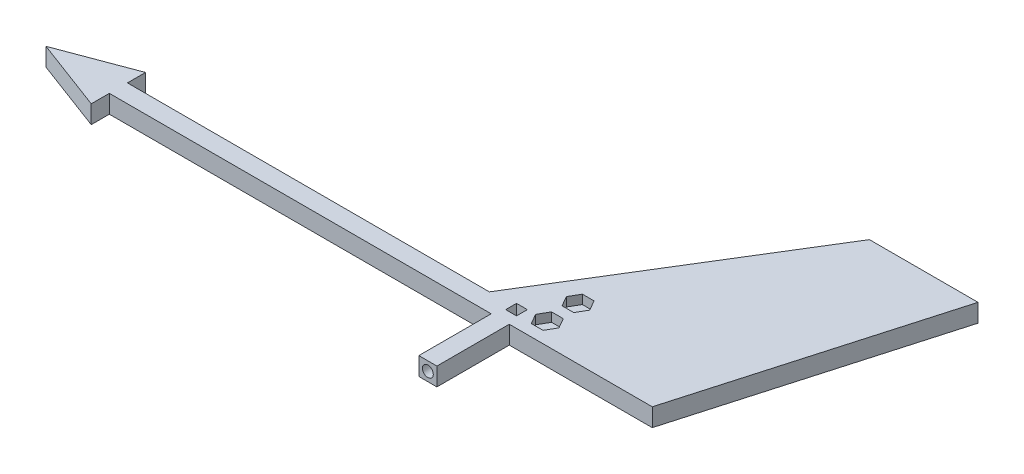
ISO-10303-21;
HEADER;
FILE_DESCRIPTION(('STEP AP214'),'2;1');
FILE_NAME('part.step','',(''),(''),'','','');
FILE_SCHEMA(('AUTOMOTIVE_DESIGN { 1 0 10303 214 1 1 1 1 }'));
ENDSEC;
DATA;
#1=APPLICATION_CONTEXT('core data for automotive mechanical design processes');
#2=APPLICATION_PROTOCOL_DEFINITION('international standard','automotive_design',2000,#1);
#3=PRODUCT_CONTEXT('',#1,'mechanical');
#4=PRODUCT('Part','Part','',(#3));
#5=PRODUCT_RELATED_PRODUCT_CATEGORY('part','',(#4));
#6=PRODUCT_DEFINITION_FORMATION('','',#4);
#7=PRODUCT_DEFINITION_CONTEXT('part definition',#1,'design');
#8=PRODUCT_DEFINITION('design','',#6,#7);
#9=PRODUCT_DEFINITION_SHAPE('','',#8);
#10=(LENGTH_UNIT() NAMED_UNIT(*) SI_UNIT(.MILLI.,.METRE.));
#11=(NAMED_UNIT(*) PLANE_ANGLE_UNIT() SI_UNIT($,.RADIAN.));
#12=(NAMED_UNIT(*) SI_UNIT($,.STERADIAN.) SOLID_ANGLE_UNIT());
#13=UNCERTAINTY_MEASURE_WITH_UNIT(LENGTH_MEASURE(1.E-05),#10,'distance_accuracy_value','');
#14=(GEOMETRIC_REPRESENTATION_CONTEXT(3) GLOBAL_UNCERTAINTY_ASSIGNED_CONTEXT((#13)) GLOBAL_UNIT_ASSIGNED_CONTEXT((#10,
#11,#12)) REPRESENTATION_CONTEXT('',''));
#15=CARTESIAN_POINT('',(0.,0.,0.));
#16=DIRECTION('',(0.,0.,1.));
#17=DIRECTION('',(1.,0.,0.));
#18=AXIS2_PLACEMENT_3D('',#15,#16,#17);
#19=CARTESIAN_POINT('',(0.,2.5,2.5));
#20=DIRECTION('',(0.,0.,-1.));
#21=DIRECTION('',(-1.,0.,0.));
#22=AXIS2_PLACEMENT_3D('',#19,#20,#21);
#23=PLANE('',#22);
#24=DIRECTION('',(0.,1.,0.));
#25=VECTOR('',#24,1.);
#26=CARTESIAN_POINT('',(110.5,-2.5,2.5));
#27=LINE('',#26,#25);
#28=CARTESIAN_POINT('',(110.5,-2.5,2.5));
#29=VERTEX_POINT('',#28);
#30=CARTESIAN_POINT('',(110.5,2.5,2.5));
#31=VERTEX_POINT('',#30);
#32=EDGE_CURVE('E284',#29,#31,#27,.T.);
#33=ORIENTED_EDGE('',*,*,#32,.F.);
#34=DIRECTION('',(1.,0.,0.));
#35=VECTOR('',#34,1.);
#36=CARTESIAN_POINT('',(0.,-2.5,2.5));
#37=LINE('',#36,#35);
#38=CARTESIAN_POINT('',(150.,-2.5,2.5));
#39=VERTEX_POINT('',#38);
#40=EDGE_CURVE('E439',#29,#39,#37,.T.);
#41=ORIENTED_EDGE('',*,*,#40,.T.);
#42=DIRECTION('',(0.,-1.,0.));
#43=VECTOR('',#42,1.);
#44=CARTESIAN_POINT('',(150.,2.5,2.5));
#45=LINE('',#44,#43);
#46=CARTESIAN_POINT('',(150.,2.5,2.5));
#47=VERTEX_POINT('',#46);
#48=EDGE_CURVE('E470',#47,#39,#45,.T.);
#49=ORIENTED_EDGE('',*,*,#48,.F.);
#50=DIRECTION('',(1.,0.,0.));
#51=VECTOR('',#50,1.);
#52=CARTESIAN_POINT('',(0.,2.5,2.5));
#53=LINE('',#52,#51);
#54=EDGE_CURVE('E418',#31,#47,#53,.T.);
#55=ORIENTED_EDGE('',*,*,#54,.F.);
#56=EDGE_LOOP('',(#33,#41,#49,#55));
#57=FACE_BOUND('',#56,.T.);
#58=ADVANCED_FACE('F41',(#57),#23,.F.);
#59=DIRECTION('',(0.,-1.,0.));
#60=VECTOR('',#59,1.);
#61=CARTESIAN_POINT('',(105.5,-2.5,2.5));
#62=LINE('',#61,#60);
#63=CARTESIAN_POINT('',(105.5,2.5,2.5));
#64=VERTEX_POINT('',#63);
#65=CARTESIAN_POINT('',(105.5,-2.5,2.5));
#66=VERTEX_POINT('',#65);
#67=EDGE_CURVE('E293',#64,#66,#62,.T.);
#68=ORIENTED_EDGE('',*,*,#67,.F.);
#69=CARTESIAN_POINT('',(0.,2.5,2.5));
#70=VERTEX_POINT('',#69);
#71=EDGE_CURVE('E419',#70,#64,#53,.T.);
#72=ORIENTED_EDGE('',*,*,#71,.F.);
#73=DIRECTION('',(0.,-1.,0.));
#74=VECTOR('',#73,1.);
#75=CARTESIAN_POINT('',(0.,2.5,2.5));
#76=LINE('',#75,#74);
#77=CARTESIAN_POINT('',(0.,-2.5,2.5));
#78=VERTEX_POINT('',#77);
#79=EDGE_CURVE('E49',#70,#78,#76,.T.);
#80=ORIENTED_EDGE('',*,*,#79,.T.);
#81=EDGE_CURVE('E440',#78,#66,#37,.T.);
#82=ORIENTED_EDGE('',*,*,#81,.T.);
#83=EDGE_LOOP('',(#68,#72,#80,#82));
#84=FACE_BOUND('',#83,.T.);
#85=ADVANCED_FACE('F477',(#84),#23,.F.);
#86=CARTESIAN_POINT('',(-20.,2.5,0.));
#87=DIRECTION('',(0.351123441588392,0.,-0.936329177569045));
#88=DIRECTION('',(-0.936329177569045,0.,-0.351123441588392));
#89=AXIS2_PLACEMENT_3D('',#86,#87,#88);
#90=PLANE('',#89);
#91=DIRECTION('',(0.936329177569045,0.,0.351123441588392));
#92=VECTOR('',#91,1.);
#93=CARTESIAN_POINT('',(-20.,-2.5,0.));
#94=LINE('',#93,#92);
#95=CARTESIAN_POINT('',(-20.,-2.5,0.));
#96=VERTEX_POINT('',#95);
#97=CARTESIAN_POINT('',(0.,-2.5,7.5));
#98=VERTEX_POINT('',#97);
#99=EDGE_CURVE('E355',#96,#98,#94,.T.);
#100=ORIENTED_EDGE('',*,*,#99,.T.);
#101=DIRECTION('',(0.,-1.,0.));
#102=VECTOR('',#101,1.);
#103=CARTESIAN_POINT('',(0.,2.5,7.5));
#104=LINE('',#103,#102);
#105=CARTESIAN_POINT('',(0.,2.5,7.5));
#106=VERTEX_POINT('',#105);
#107=EDGE_CURVE('E11',#106,#98,#104,.T.);
#108=ORIENTED_EDGE('',*,*,#107,.F.);
#109=DIRECTION('',(0.936329177569045,0.,0.351123441588392));
#110=VECTOR('',#109,1.);
#111=CARTESIAN_POINT('',(-20.,2.5,0.));
#112=LINE('',#111,#110);
#113=CARTESIAN_POINT('',(-20.,2.5,0.));
#114=VERTEX_POINT('',#113);
#115=EDGE_CURVE('E412',#114,#106,#112,.T.);
#116=ORIENTED_EDGE('',*,*,#115,.F.);
#117=DIRECTION('',(0.,-1.,0.));
#118=VECTOR('',#117,1.);
#119=CARTESIAN_POINT('',(-20.,2.5,0.));
#120=LINE('',#119,#118);
#121=EDGE_CURVE('E434',#114,#96,#120,.T.);
#122=ORIENTED_EDGE('',*,*,#121,.T.);
#123=EDGE_LOOP('',(#100,#108,#116,#122));
#124=FACE_BOUND('',#123,.T.);
#125=ADVANCED_FACE('F43',(#124),#90,.F.);
#126=CARTESIAN_POINT('',(0.,2.5,7.5));
#127=DIRECTION('',(-1.,0.,0.));
#128=DIRECTION('',(0.,0.,1.));
#129=AXIS2_PLACEMENT_3D('',#126,#127,#128);
#130=PLANE('',#129);
#131=DIRECTION('',(0.,0.,-1.));
#132=VECTOR('',#131,1.);
#133=CARTESIAN_POINT('',(0.,-2.5,7.5));
#134=LINE('',#133,#132);
#135=EDGE_CURVE('E437',#98,#78,#134,.T.);
#136=ORIENTED_EDGE('',*,*,#135,.T.);
#137=ORIENTED_EDGE('',*,*,#79,.F.);
#138=DIRECTION('',(0.,0.,-1.));
#139=VECTOR('',#138,1.);
#140=CARTESIAN_POINT('',(0.,2.5,7.5));
#141=LINE('',#140,#139);
#142=EDGE_CURVE('E415',#106,#70,#141,.T.);
#143=ORIENTED_EDGE('',*,*,#142,.F.);
#144=ORIENTED_EDGE('',*,*,#107,.T.);
#145=EDGE_LOOP('',(#136,#137,#143,#144));
#146=FACE_BOUND('',#145,.T.);
#147=ADVANCED_FACE('F493',(#146),#130,.F.);
#148=CARTESIAN_POINT('',(150.,2.5,2.5));
#149=DIRECTION('',(-0.961523947640823,0.,-0.274721127897378));
#150=DIRECTION('',(-0.274721127897378,0.,0.961523947640823));
#151=AXIS2_PLACEMENT_3D('',#148,#149,#150);
#152=PLANE('',#151);
#153=DIRECTION('',(0.274721127897378,0.,-0.961523947640823));
#154=VECTOR('',#153,1.);
#155=CARTESIAN_POINT('',(150.,-2.5,2.5));
#156=LINE('',#155,#154);
#157=CARTESIAN_POINT('',(170.,-2.5,-67.5));
#158=VERTEX_POINT('',#157);
#159=EDGE_CURVE('E442',#39,#158,#156,.T.);
#160=ORIENTED_EDGE('',*,*,#159,.T.);
#161=DIRECTION('',(0.,-1.,0.));
#162=VECTOR('',#161,1.);
#163=CARTESIAN_POINT('',(170.,2.5,-67.5));
#164=LINE('',#163,#162);
#165=CARTESIAN_POINT('',(170.,2.5,-67.5));
#166=VERTEX_POINT('',#165);
#167=EDGE_CURVE('E467',#166,#158,#164,.T.);
#168=ORIENTED_EDGE('',*,*,#167,.F.);
#169=DIRECTION('',(0.274721127897378,0.,-0.961523947640823));
#170=VECTOR('',#169,1.);
#171=CARTESIAN_POINT('',(150.,2.5,2.5));
#172=LINE('',#171,#170);
#173=EDGE_CURVE('E422',#47,#166,#172,.T.);
#174=ORIENTED_EDGE('',*,*,#173,.F.);
#175=ORIENTED_EDGE('',*,*,#48,.T.);
#176=EDGE_LOOP('',(#160,#168,#174,#175));
#177=FACE_BOUND('',#176,.T.);
#178=ADVANCED_FACE('F524',(#177),#152,.F.);
#179=CARTESIAN_POINT('',(170.,2.5,-67.5));
#180=DIRECTION('',(0.,0.,1.));
#181=DIRECTION('',(1.,0.,0.));
#182=AXIS2_PLACEMENT_3D('',#179,#180,#181);
#183=PLANE('',#182);
#184=DIRECTION('',(-1.,0.,0.));
#185=VECTOR('',#184,1.);
#186=CARTESIAN_POINT('',(170.,-2.5,-67.5));
#187=LINE('',#186,#185);
#188=CARTESIAN_POINT('',(140.,-2.5,-67.5));
#189=VERTEX_POINT('',#188);
#190=EDGE_CURVE('E444',#158,#189,#187,.T.);
#191=ORIENTED_EDGE('',*,*,#190,.T.);
#192=DIRECTION('',(0.,-1.,0.));
#193=VECTOR('',#192,1.);
#194=CARTESIAN_POINT('',(140.,2.5,-67.5));
#195=LINE('',#194,#193);
#196=CARTESIAN_POINT('',(140.,2.5,-67.5));
#197=VERTEX_POINT('',#196);
#198=EDGE_CURVE('E464',#197,#189,#195,.T.);
#199=ORIENTED_EDGE('',*,*,#198,.F.);
#200=DIRECTION('',(-1.,0.,0.));
#201=VECTOR('',#200,1.);
#202=CARTESIAN_POINT('',(170.,2.5,-67.5));
#203=LINE('',#202,#201);
#204=EDGE_CURVE('E424',#166,#197,#203,.T.);
#205=ORIENTED_EDGE('',*,*,#204,.F.);
#206=ORIENTED_EDGE('',*,*,#167,.T.);
#207=EDGE_LOOP('',(#191,#199,#205,#206));
#208=FACE_BOUND('',#207,.T.);
#209=ADVANCED_FACE('F520',(#208),#183,.F.);
#210=CARTESIAN_POINT('',(140.,2.5,-67.5));
#211=DIRECTION('',(0.851658316704544,0.,0.524097425664335));
#212=DIRECTION('',(0.524097425664335,0.,-0.851658316704544));
#213=AXIS2_PLACEMENT_3D('',#210,#211,#212);
#214=PLANE('',#213);
#215=DIRECTION('',(-0.524097425664335,0.,0.851658316704544));
#216=VECTOR('',#215,1.);
#217=CARTESIAN_POINT('',(140.,-2.5,-67.5));
#218=LINE('',#217,#216);
#219=CARTESIAN_POINT('',(100.,-2.5,-2.5));
#220=VERTEX_POINT('',#219);
#221=EDGE_CURVE('E446',#189,#220,#218,.T.);
#222=ORIENTED_EDGE('',*,*,#221,.T.);
#223=DIRECTION('',(0.,-1.,0.));
#224=VECTOR('',#223,1.);
#225=CARTESIAN_POINT('',(100.,2.5,-2.5));
#226=LINE('',#225,#224);
#227=CARTESIAN_POINT('',(100.,2.5,-2.5));
#228=VERTEX_POINT('',#227);
#229=EDGE_CURVE('E461',#228,#220,#226,.T.);
#230=ORIENTED_EDGE('',*,*,#229,.F.);
#231=DIRECTION('',(-0.524097425664335,0.,0.851658316704544));
#232=VECTOR('',#231,1.);
#233=CARTESIAN_POINT('',(140.,2.5,-67.5));
#234=LINE('',#233,#232);
#235=EDGE_CURVE('E426',#197,#228,#234,.T.);
#236=ORIENTED_EDGE('',*,*,#235,.F.);
#237=ORIENTED_EDGE('',*,*,#198,.T.);
#238=EDGE_LOOP('',(#222,#230,#236,#237));
#239=FACE_BOUND('',#238,.T.);
#240=ADVANCED_FACE('F515',(#239),#214,.F.);
#241=CARTESIAN_POINT('',(0.,2.5,-2.5));
#242=DIRECTION('',(0.,0.,1.));
#243=DIRECTION('',(1.,0.,0.));
#244=AXIS2_PLACEMENT_3D('',#241,#242,#243);
#245=PLANE('',#244);
#246=DIRECTION('',(-1.,0.,0.));
#247=VECTOR('',#246,1.);
#248=CARTESIAN_POINT('',(0.,-2.5,-2.5));
#249=LINE('',#248,#247);
#250=CARTESIAN_POINT('',(0.,-2.5,-2.5));
#251=VERTEX_POINT('',#250);
#252=EDGE_CURVE('E448',#220,#251,#249,.T.);
#253=ORIENTED_EDGE('',*,*,#252,.T.);
#254=DIRECTION('',(0.,-1.,0.));
#255=VECTOR('',#254,1.);
#256=CARTESIAN_POINT('',(0.,2.5,-2.5));
#257=LINE('',#256,#255);
#258=CARTESIAN_POINT('',(0.,2.5,-2.5));
#259=VERTEX_POINT('',#258);
#260=EDGE_CURVE('E458',#259,#251,#257,.T.);
#261=ORIENTED_EDGE('',*,*,#260,.F.);
#262=DIRECTION('',(-1.,0.,0.));
#263=VECTOR('',#262,1.);
#264=CARTESIAN_POINT('',(0.,2.5,-2.5));
#265=LINE('',#264,#263);
#266=EDGE_CURVE('E428',#228,#259,#265,.T.);
#267=ORIENTED_EDGE('',*,*,#266,.F.);
#268=ORIENTED_EDGE('',*,*,#229,.T.);
#269=EDGE_LOOP('',(#253,#261,#267,#268));
#270=FACE_BOUND('',#269,.T.);
#271=ADVANCED_FACE('F509',(#270),#245,.F.);
#272=CARTESIAN_POINT('',(0.,2.5,-7.5));
#273=DIRECTION('',(-1.,0.,0.));
#274=DIRECTION('',(0.,0.,1.));
#275=AXIS2_PLACEMENT_3D('',#272,#273,#274);
#276=PLANE('',#275);
#277=DIRECTION('',(0.,0.,-1.));
#278=VECTOR('',#277,1.);
#279=CARTESIAN_POINT('',(0.,-2.5,-7.5));
#280=LINE('',#279,#278);
#281=CARTESIAN_POINT('',(0.,-2.5,-7.5));
#282=VERTEX_POINT('',#281);
#283=EDGE_CURVE('E450',#251,#282,#280,.T.);
#284=ORIENTED_EDGE('',*,*,#283,.T.);
#285=DIRECTION('',(0.,-1.,0.));
#286=VECTOR('',#285,1.);
#287=CARTESIAN_POINT('',(0.,2.5,-7.5));
#288=LINE('',#287,#286);
#289=CARTESIAN_POINT('',(0.,2.5,-7.5));
#290=VERTEX_POINT('',#289);
#291=EDGE_CURVE('E455',#290,#282,#288,.T.);
#292=ORIENTED_EDGE('',*,*,#291,.F.);
#293=DIRECTION('',(0.,0.,-1.));
#294=VECTOR('',#293,1.);
#295=CARTESIAN_POINT('',(0.,2.5,-7.5));
#296=LINE('',#295,#294);
#297=EDGE_CURVE('E430',#259,#290,#296,.T.);
#298=ORIENTED_EDGE('',*,*,#297,.F.);
#299=ORIENTED_EDGE('',*,*,#260,.T.);
#300=EDGE_LOOP('',(#284,#292,#298,#299));
#301=FACE_BOUND('',#300,.T.);
#302=ADVANCED_FACE('F505',(#301),#276,.F.);
#303=CARTESIAN_POINT('',(-20.,2.5,0.));
#304=DIRECTION('',(0.351123441588392,0.,0.936329177569045));
#305=DIRECTION('',(0.936329177569045,0.,-0.351123441588392));
#306=AXIS2_PLACEMENT_3D('',#303,#304,#305);
#307=PLANE('',#306);
#308=DIRECTION('',(-0.936329177569045,0.,0.351123441588392));
#309=VECTOR('',#308,1.);
#310=CARTESIAN_POINT('',(-20.,-2.5,0.));
#311=LINE('',#310,#309);
#312=EDGE_CURVE('E416',#282,#96,#311,.T.);
#313=ORIENTED_EDGE('',*,*,#312,.T.);
#314=ORIENTED_EDGE('',*,*,#121,.F.);
#315=DIRECTION('',(-0.936329177569045,0.,0.351123441588392));
#316=VECTOR('',#315,1.);
#317=CARTESIAN_POINT('',(-20.,2.5,0.));
#318=LINE('',#317,#316);
#319=EDGE_CURVE('E432',#290,#114,#318,.T.);
#320=ORIENTED_EDGE('',*,*,#319,.F.);
#321=ORIENTED_EDGE('',*,*,#291,.T.);
#322=EDGE_LOOP('',(#313,#314,#320,#321));
#323=FACE_BOUND('',#322,.T.);
#324=ADVANCED_FACE('F500',(#323),#307,.F.);
#325=CARTESIAN_POINT('',(0.,2.5,0.));
#326=DIRECTION('',(0.,1.,0.));
#327=DIRECTION('',(0.,0.,1.));
#328=AXIS2_PLACEMENT_3D('',#325,#326,#327);
#329=PLANE('',#328);
#330=DIRECTION('',(0.,0.,-1.));
#331=VECTOR('',#330,1.);
#332=CARTESIAN_POINT('',(109.5,2.5,-0.5));
#333=LINE('',#332,#331);
#334=CARTESIAN_POINT('',(109.5,2.5,-0.5));
#335=VERTEX_POINT('',#334);
#336=CARTESIAN_POINT('',(109.5,2.5,-3.5));
#337=VERTEX_POINT('',#336);
#338=EDGE_CURVE('E64',#335,#337,#333,.T.);
#339=ORIENTED_EDGE('',*,*,#338,.F.);
#340=DIRECTION('',(1.,0.,0.));
#341=VECTOR('',#340,1.);
#342=CARTESIAN_POINT('',(106.5,2.5,-0.5));
#343=LINE('',#342,#341);
#344=CARTESIAN_POINT('',(106.5,2.5,-0.5));
#345=VERTEX_POINT('',#344);
#346=EDGE_CURVE('E260',#345,#335,#343,.T.);
#347=ORIENTED_EDGE('',*,*,#346,.F.);
#348=DIRECTION('',(0.,0.,1.));
#349=VECTOR('',#348,1.);
#350=CARTESIAN_POINT('',(106.5,2.5,-0.5));
#351=LINE('',#350,#349);
#352=CARTESIAN_POINT('',(106.5,2.5,-3.5));
#353=VERTEX_POINT('',#352);
#354=EDGE_CURVE('E263',#353,#345,#351,.T.);
#355=ORIENTED_EDGE('',*,*,#354,.F.);
#356=DIRECTION('',(-1.,0.,0.));
#357=VECTOR('',#356,1.);
#358=CARTESIAN_POINT('',(106.5,2.5,-3.5));
#359=LINE('',#358,#357);
#360=EDGE_CURVE('E269',#337,#353,#359,.T.);
#361=ORIENTED_EDGE('',*,*,#360,.F.);
#362=EDGE_LOOP('',(#339,#347,#355,#361));
#363=FACE_BOUND('',#362,.T.);
#364=DIRECTION('',(0.500000000000001,0.,-0.866025403784438));
#365=VECTOR('',#364,1.);
#366=CARTESIAN_POINT('',(116.616580753731,2.5,-9.20000000000008));
#367=LINE('',#366,#365);
#368=CARTESIAN_POINT('',(116.616580753731,2.5,-9.20000000000008));
#369=VERTEX_POINT('',#368);
#370=CARTESIAN_POINT('',(118.233161507462,2.5,-12.));
#371=VERTEX_POINT('',#370);
#372=EDGE_CURVE('E336',#369,#371,#367,.T.);
#373=ORIENTED_EDGE('',*,*,#372,.F.);
#374=DIRECTION('',(1.,0.,0.));
#375=VECTOR('',#374,1.);
#376=CARTESIAN_POINT('',(113.383419246269,2.5,-9.20000000000008));
#377=LINE('',#376,#375);
#378=CARTESIAN_POINT('',(113.383419246269,2.5,-9.20000000000008));
#379=VERTEX_POINT('',#378);
#380=EDGE_CURVE('E320',#379,#369,#377,.T.);
#381=ORIENTED_EDGE('',*,*,#380,.F.);
#382=DIRECTION('',(0.500000000000003,0.,0.866025403784437));
#383=VECTOR('',#382,1.);
#384=CARTESIAN_POINT('',(111.766838492538,2.5,-12.0000000000001));
#385=LINE('',#384,#383);
#386=CARTESIAN_POINT('',(111.766838492538,2.5,-12.0000000000001));
#387=VERTEX_POINT('',#386);
#388=EDGE_CURVE('E348',#387,#379,#385,.T.);
#389=ORIENTED_EDGE('',*,*,#388,.F.);
#390=DIRECTION('',(-0.5,0.,0.866025403784439));
#391=VECTOR('',#390,1.);
#392=CARTESIAN_POINT('',(113.383419246269,2.5,-14.8000000000001));
#393=LINE('',#392,#391);
#394=CARTESIAN_POINT('',(113.383419246269,2.5,-14.8000000000001));
#395=VERTEX_POINT('',#394);
#396=EDGE_CURVE('E345',#395,#387,#393,.T.);
#397=ORIENTED_EDGE('',*,*,#396,.F.);
#398=DIRECTION('',(-1.,0.,0.));
#399=VECTOR('',#398,1.);
#400=CARTESIAN_POINT('',(116.616580753731,2.5,-14.8000000000001));
#401=LINE('',#400,#399);
#402=CARTESIAN_POINT('',(116.616580753731,2.5,-14.8000000000001));
#403=VERTEX_POINT('',#402);
#404=EDGE_CURVE('E342',#403,#395,#401,.T.);
#405=ORIENTED_EDGE('',*,*,#404,.F.);
#406=DIRECTION('',(-0.499999999999986,0.,-0.866025403784447));
#407=VECTOR('',#406,1.);
#408=CARTESIAN_POINT('',(118.233161507462,2.5,-12.));
#409=LINE('',#408,#407);
#410=EDGE_CURVE('E338',#371,#403,#409,.T.);
#411=ORIENTED_EDGE('',*,*,#410,.F.);
#412=EDGE_LOOP('',(#373,#381,#389,#397,#405,#411));
#413=FACE_BOUND('',#412,.T.);
#414=DIRECTION('',(0.5,0.,-0.866025403784438));
#415=VECTOR('',#414,1.);
#416=CARTESIAN_POINT('',(116.616580753731,2.5,-0.700000000000006));
#417=LINE('',#416,#415);
#418=CARTESIAN_POINT('',(116.616580753731,2.5,-0.700000000000006));
#419=VERTEX_POINT('',#418);
#420=CARTESIAN_POINT('',(118.233161507462,2.5,-3.50000000000002));
#421=VERTEX_POINT('',#420);
#422=EDGE_CURVE('E339',#419,#421,#417,.T.);
#423=ORIENTED_EDGE('',*,*,#422,.F.);
#424=DIRECTION('',(1.,0.,0.));
#425=VECTOR('',#424,1.);
#426=CARTESIAN_POINT('',(113.383419246269,2.5,-0.700000000000006));
#427=LINE('',#426,#425);
#428=CARTESIAN_POINT('',(113.383419246269,2.5,-0.700000000000006));
#429=VERTEX_POINT('',#428);
#430=EDGE_CURVE('E379',#429,#419,#427,.T.);
#431=ORIENTED_EDGE('',*,*,#430,.F.);
#432=DIRECTION('',(0.500000000000001,0.,0.866025403784438));
#433=VECTOR('',#432,1.);
#434=CARTESIAN_POINT('',(111.766838492538,2.5,-3.50000000000001));
#435=LINE('',#434,#433);
#436=CARTESIAN_POINT('',(111.766838492538,2.5,-3.50000000000001));
#437=VERTEX_POINT('',#436);
#438=EDGE_CURVE('E382',#437,#429,#435,.T.);
#439=ORIENTED_EDGE('',*,*,#438,.F.);
#440=DIRECTION('',(-0.499999999999999,0.,0.866025403784439));
#441=VECTOR('',#440,1.);
#442=CARTESIAN_POINT('',(113.383419246269,2.5,-6.30000000000003));
#443=LINE('',#442,#441);
#444=CARTESIAN_POINT('',(113.383419246269,2.5,-6.30000000000003));
#445=VERTEX_POINT('',#444);
#446=EDGE_CURVE('E386',#445,#437,#443,.T.);
#447=ORIENTED_EDGE('',*,*,#446,.F.);
#448=DIRECTION('',(-1.,0.,0.));
#449=VECTOR('',#448,1.);
#450=CARTESIAN_POINT('',(116.616580753731,2.5,-6.30000000000003));
#451=LINE('',#450,#449);
#452=CARTESIAN_POINT('',(116.616580753731,2.5,-6.30000000000003));
#453=VERTEX_POINT('',#452);
#454=EDGE_CURVE('E389',#453,#445,#451,.T.);
#455=ORIENTED_EDGE('',*,*,#454,.F.);
#456=DIRECTION('',(-0.5,0.,-0.866025403784439));
#457=VECTOR('',#456,1.);
#458=CARTESIAN_POINT('',(118.233161507462,2.5,-3.50000000000002));
#459=LINE('',#458,#457);
#460=EDGE_CURVE('E392',#421,#453,#459,.T.);
#461=ORIENTED_EDGE('',*,*,#460,.F.);
#462=EDGE_LOOP('',(#423,#431,#439,#447,#455,#461));
#463=FACE_BOUND('',#462,.T.);
#464=ORIENTED_EDGE('',*,*,#115,.T.);
#465=ORIENTED_EDGE('',*,*,#142,.T.);
#466=ORIENTED_EDGE('',*,*,#71,.T.);
#467=DIRECTION('',(0.,0.,-1.));
#468=VECTOR('',#467,1.);
#469=CARTESIAN_POINT('',(105.5,2.5,22.5));
#470=LINE('',#469,#468);
#471=CARTESIAN_POINT('',(105.5,2.5,22.5));
#472=VERTEX_POINT('',#471);
#473=EDGE_CURVE('E309',#472,#64,#470,.T.);
#474=ORIENTED_EDGE('',*,*,#473,.F.);
#475=DIRECTION('',(-1.,0.,0.));
#476=VECTOR('',#475,1.);
#477=CARTESIAN_POINT('',(105.5,2.5,22.5));
#478=LINE('',#477,#476);
#479=CARTESIAN_POINT('',(110.5,2.5,22.5));
#480=VERTEX_POINT('',#479);
#481=EDGE_CURVE('E292',#480,#472,#478,.T.);
#482=ORIENTED_EDGE('',*,*,#481,.F.);
#483=DIRECTION('',(0.,0.,-1.));
#484=VECTOR('',#483,1.);
#485=CARTESIAN_POINT('',(110.5,2.5,22.5));
#486=LINE('',#485,#484);
#487=EDGE_CURVE('E312',#480,#31,#486,.T.);
#488=ORIENTED_EDGE('',*,*,#487,.T.);
#489=ORIENTED_EDGE('',*,*,#54,.T.);
#490=ORIENTED_EDGE('',*,*,#173,.T.);
#491=ORIENTED_EDGE('',*,*,#204,.T.);
#492=ORIENTED_EDGE('',*,*,#235,.T.);
#493=ORIENTED_EDGE('',*,*,#266,.T.);
#494=ORIENTED_EDGE('',*,*,#297,.T.);
#495=ORIENTED_EDGE('',*,*,#319,.T.);
#496=EDGE_LOOP('',(#464,#465,#466,#474,#482,#488,#489,#490,#491,#492,#493,#494,#495));
#497=FACE_BOUND('',#496,.T.);
#498=ADVANCED_FACE('F490',(#363,#413,#463,#497),#329,.T.);
#499=CARTESIAN_POINT('',(0.,-2.5,0.));
#500=DIRECTION('',(0.,1.,0.));
#501=DIRECTION('',(0.,0.,1.));
#502=AXIS2_PLACEMENT_3D('',#499,#500,#501);
#503=PLANE('',#502);
#504=ORIENTED_EDGE('',*,*,#99,.F.);
#505=ORIENTED_EDGE('',*,*,#312,.F.);
#506=ORIENTED_EDGE('',*,*,#283,.F.);
#507=ORIENTED_EDGE('',*,*,#252,.F.);
#508=ORIENTED_EDGE('',*,*,#221,.F.);
#509=ORIENTED_EDGE('',*,*,#190,.F.);
#510=ORIENTED_EDGE('',*,*,#159,.F.);
#511=ORIENTED_EDGE('',*,*,#40,.F.);
#512=DIRECTION('',(0.,0.,-1.));
#513=VECTOR('',#512,1.);
#514=CARTESIAN_POINT('',(110.5,-2.5,22.5));
#515=LINE('',#514,#513);
#516=CARTESIAN_POINT('',(110.5,-2.5,22.5));
#517=VERTEX_POINT('',#516);
#518=EDGE_CURVE('E299',#517,#29,#515,.T.);
#519=ORIENTED_EDGE('',*,*,#518,.F.);
#520=DIRECTION('',(1.,0.,0.));
#521=VECTOR('',#520,1.);
#522=CARTESIAN_POINT('',(105.5,-2.5,22.5));
#523=LINE('',#522,#521);
#524=CARTESIAN_POINT('',(105.5,-2.5,22.5));
#525=VERTEX_POINT('',#524);
#526=EDGE_CURVE('E297',#525,#517,#523,.T.);
#527=ORIENTED_EDGE('',*,*,#526,.F.);
#528=DIRECTION('',(0.,0.,-1.));
#529=VECTOR('',#528,1.);
#530=CARTESIAN_POINT('',(105.5,-2.5,22.5));
#531=LINE('',#530,#529);
#532=EDGE_CURVE('E306',#525,#66,#531,.T.);
#533=ORIENTED_EDGE('',*,*,#532,.T.);
#534=ORIENTED_EDGE('',*,*,#81,.F.);
#535=ORIENTED_EDGE('',*,*,#135,.F.);
#536=EDGE_LOOP('',(#504,#505,#506,#507,#508,#509,#510,#511,#519,#527,#533,#534,#535));
#537=FACE_BOUND('',#536,.T.);
#538=ADVANCED_FACE('F481',(#537),#503,.F.);
#539=CARTESIAN_POINT('',(116.616580753731,0.,-0.700000000000006));
#540=DIRECTION('',(0.866025403784438,0.,0.5));
#541=DIRECTION('',(0.5,0.,-0.866025403784438));
#542=AXIS2_PLACEMENT_3D('',#539,#540,#541);
#543=PLANE('',#542);
#544=ORIENTED_EDGE('',*,*,#422,.T.);
#545=DIRECTION('',(0.,1.,0.));
#546=VECTOR('',#545,1.);
#547=CARTESIAN_POINT('',(118.233161507462,0.,-3.50000000000002));
#548=LINE('',#547,#546);
#549=CARTESIAN_POINT('',(118.233161507462,0.,-3.50000000000002));
#550=VERTEX_POINT('',#549);
#551=EDGE_CURVE('E366',#550,#421,#548,.T.);
#552=ORIENTED_EDGE('',*,*,#551,.F.);
#553=DIRECTION('',(0.5,0.,-0.866025403784438));
#554=VECTOR('',#553,1.);
#555=CARTESIAN_POINT('',(116.616580753731,0.,-0.700000000000006));
#556=LINE('',#555,#554);
#557=CARTESIAN_POINT('',(116.616580753731,0.,-0.700000000000006));
#558=VERTEX_POINT('',#557);
#559=EDGE_CURVE('E383',#558,#550,#556,.T.);
#560=ORIENTED_EDGE('',*,*,#559,.F.);
#561=DIRECTION('',(0.,1.,0.));
#562=VECTOR('',#561,1.);
#563=CARTESIAN_POINT('',(116.616580753731,0.,-0.700000000000006));
#564=LINE('',#563,#562);
#565=EDGE_CURVE('E315',#558,#419,#564,.T.);
#566=ORIENTED_EDGE('',*,*,#565,.T.);
#567=EDGE_LOOP('',(#544,#552,#560,#566));
#568=FACE_BOUND('',#567,.T.);
#569=ADVANCED_FACE('F635',(#568),#543,.F.);
#570=CARTESIAN_POINT('',(113.383419246269,0.,-0.700000000000006));
#571=DIRECTION('',(0.,0.,1.));
#572=DIRECTION('',(1.,0.,0.));
#573=AXIS2_PLACEMENT_3D('',#570,#571,#572);
#574=PLANE('',#573);
#575=ORIENTED_EDGE('',*,*,#430,.T.);
#576=ORIENTED_EDGE('',*,*,#565,.F.);
#577=DIRECTION('',(1.,0.,0.));
#578=VECTOR('',#577,1.);
#579=CARTESIAN_POINT('',(113.383419246269,0.,-0.700000000000006));
#580=LINE('',#579,#578);
#581=CARTESIAN_POINT('',(113.383419246269,0.,-0.700000000000006));
#582=VERTEX_POINT('',#581);
#583=EDGE_CURVE('E369',#582,#558,#580,.T.);
#584=ORIENTED_EDGE('',*,*,#583,.F.);
#585=DIRECTION('',(0.,1.,0.));
#586=VECTOR('',#585,1.);
#587=CARTESIAN_POINT('',(113.383419246269,0.,-0.700000000000006));
#588=LINE('',#587,#586);
#589=EDGE_CURVE('E376',#582,#429,#588,.T.);
#590=ORIENTED_EDGE('',*,*,#589,.T.);
#591=EDGE_LOOP('',(#575,#576,#584,#590));
#592=FACE_BOUND('',#591,.T.);
#593=ADVANCED_FACE('F645',(#592),#574,.F.);
#594=CARTESIAN_POINT('',(111.766838492538,0.,-3.50000000000001));
#595=DIRECTION('',(-0.866025403784438,0.,0.500000000000001));
#596=DIRECTION('',(0.500000000000001,0.,0.866025403784438));
#597=AXIS2_PLACEMENT_3D('',#594,#595,#596);
#598=PLANE('',#597);
#599=ORIENTED_EDGE('',*,*,#438,.T.);
#600=ORIENTED_EDGE('',*,*,#589,.F.);
#601=DIRECTION('',(0.500000000000001,0.,0.866025403784438));
#602=VECTOR('',#601,1.);
#603=CARTESIAN_POINT('',(111.766838492538,0.,-3.50000000000001));
#604=LINE('',#603,#602);
#605=CARTESIAN_POINT('',(111.766838492538,0.,-3.50000000000001));
#606=VERTEX_POINT('',#605);
#607=EDGE_CURVE('E398',#606,#582,#604,.T.);
#608=ORIENTED_EDGE('',*,*,#607,.F.);
#609=DIRECTION('',(0.,1.,0.));
#610=VECTOR('',#609,1.);
#611=CARTESIAN_POINT('',(111.766838492538,0.,-3.50000000000001));
#612=LINE('',#611,#610);
#613=EDGE_CURVE('E374',#606,#437,#612,.T.);
#614=ORIENTED_EDGE('',*,*,#613,.T.);
#615=EDGE_LOOP('',(#599,#600,#608,#614));
#616=FACE_BOUND('',#615,.T.);
#617=ADVANCED_FACE('F655',(#616),#598,.F.);
#618=CARTESIAN_POINT('',(113.383419246269,0.,-6.30000000000003));
#619=DIRECTION('',(-0.866025403784439,0.,-0.499999999999999));
#620=DIRECTION('',(-0.499999999999999,0.,0.866025403784439));
#621=AXIS2_PLACEMENT_3D('',#618,#619,#620);
#622=PLANE('',#621);
#623=ORIENTED_EDGE('',*,*,#446,.T.);
#624=ORIENTED_EDGE('',*,*,#613,.F.);
#625=DIRECTION('',(-0.499999999999999,0.,0.866025403784439));
#626=VECTOR('',#625,1.);
#627=CARTESIAN_POINT('',(113.383419246269,0.,-6.30000000000003));
#628=LINE('',#627,#626);
#629=CARTESIAN_POINT('',(113.383419246269,0.,-6.30000000000003));
#630=VERTEX_POINT('',#629);
#631=EDGE_CURVE('E401',#630,#606,#628,.T.);
#632=ORIENTED_EDGE('',*,*,#631,.F.);
#633=DIRECTION('',(0.,1.,0.));
#634=VECTOR('',#633,1.);
#635=CARTESIAN_POINT('',(113.383419246269,0.,-6.30000000000003));
#636=LINE('',#635,#634);
#637=EDGE_CURVE('E372',#630,#445,#636,.T.);
#638=ORIENTED_EDGE('',*,*,#637,.T.);
#639=EDGE_LOOP('',(#623,#624,#632,#638));
#640=FACE_BOUND('',#639,.T.);
#641=ADVANCED_FACE('F665',(#640),#622,.F.);
#642=CARTESIAN_POINT('',(116.616580753731,0.,-6.30000000000003));
#643=DIRECTION('',(0.,0.,-1.));
#644=DIRECTION('',(-1.,0.,0.));
#645=AXIS2_PLACEMENT_3D('',#642,#643,#644);
#646=PLANE('',#645);
#647=ORIENTED_EDGE('',*,*,#454,.T.);
#648=ORIENTED_EDGE('',*,*,#637,.F.);
#649=DIRECTION('',(-1.,0.,0.));
#650=VECTOR('',#649,1.);
#651=CARTESIAN_POINT('',(116.616580753731,0.,-6.30000000000003));
#652=LINE('',#651,#650);
#653=CARTESIAN_POINT('',(116.616580753731,0.,-6.30000000000003));
#654=VERTEX_POINT('',#653);
#655=EDGE_CURVE('E404',#654,#630,#652,.T.);
#656=ORIENTED_EDGE('',*,*,#655,.F.);
#657=DIRECTION('',(0.,1.,0.));
#658=VECTOR('',#657,1.);
#659=CARTESIAN_POINT('',(116.616580753731,0.,-6.30000000000003));
#660=LINE('',#659,#658);
#661=EDGE_CURVE('E370',#654,#453,#660,.T.);
#662=ORIENTED_EDGE('',*,*,#661,.T.);
#663=EDGE_LOOP('',(#647,#648,#656,#662));
#664=FACE_BOUND('',#663,.T.);
#665=ADVANCED_FACE('F675',(#664),#646,.F.);
#666=CARTESIAN_POINT('',(118.233161507462,0.,-3.50000000000002));
#667=DIRECTION('',(0.866025403784439,0.,-0.5));
#668=DIRECTION('',(-0.5,0.,-0.866025403784439));
#669=AXIS2_PLACEMENT_3D('',#666,#667,#668);
#670=PLANE('',#669);
#671=ORIENTED_EDGE('',*,*,#460,.T.);
#672=ORIENTED_EDGE('',*,*,#661,.F.);
#673=DIRECTION('',(-0.5,0.,-0.866025403784439));
#674=VECTOR('',#673,1.);
#675=CARTESIAN_POINT('',(118.233161507462,0.,-3.50000000000002));
#676=LINE('',#675,#674);
#677=EDGE_CURVE('E407',#550,#654,#676,.T.);
#678=ORIENTED_EDGE('',*,*,#677,.F.);
#679=ORIENTED_EDGE('',*,*,#551,.T.);
#680=EDGE_LOOP('',(#671,#672,#678,#679));
#681=FACE_BOUND('',#680,.T.);
#682=ADVANCED_FACE('F685',(#681),#670,.F.);
#683=CARTESIAN_POINT('',(0.,0.,0.));
#684=DIRECTION('',(0.,1.,0.));
#685=DIRECTION('',(0.,0.,1.));
#686=AXIS2_PLACEMENT_3D('',#683,#684,#685);
#687=PLANE('',#686);
#688=ORIENTED_EDGE('',*,*,#559,.T.);
#689=ORIENTED_EDGE('',*,*,#677,.T.);
#690=ORIENTED_EDGE('',*,*,#655,.T.);
#691=ORIENTED_EDGE('',*,*,#631,.T.);
#692=ORIENTED_EDGE('',*,*,#607,.T.);
#693=ORIENTED_EDGE('',*,*,#583,.T.);
#694=EDGE_LOOP('',(#688,#689,#690,#691,#692,#693));
#695=FACE_BOUND('',#694,.T.);
#696=ADVANCED_FACE('F695',(#695),#687,.T.);
#697=CARTESIAN_POINT('',(116.616580753731,0.,-9.20000000000008));
#698=DIRECTION('',(0.866025403784438,0.,0.500000000000001));
#699=DIRECTION('',(0.500000000000001,0.,-0.866025403784438));
#700=AXIS2_PLACEMENT_3D('',#697,#698,#699);
#701=PLANE('',#700);
#702=ORIENTED_EDGE('',*,*,#372,.T.);
#703=DIRECTION('',(0.,1.,0.));
#704=VECTOR('',#703,1.);
#705=CARTESIAN_POINT('',(118.233161507462,0.,-12.));
#706=LINE('',#705,#704);
#707=CARTESIAN_POINT('',(118.233161507462,0.,-12.));
#708=VERTEX_POINT('',#707);
#709=EDGE_CURVE('E335',#708,#371,#706,.T.);
#710=ORIENTED_EDGE('',*,*,#709,.F.);
#711=DIRECTION('',(0.500000000000001,0.,-0.866025403784438));
#712=VECTOR('',#711,1.);
#713=CARTESIAN_POINT('',(116.616580753731,0.,-9.20000000000008));
#714=LINE('',#713,#712);
#715=CARTESIAN_POINT('',(116.616580753731,0.,-9.20000000000008));
#716=VERTEX_POINT('',#715);
#717=EDGE_CURVE('E316',#716,#708,#714,.T.);
#718=ORIENTED_EDGE('',*,*,#717,.F.);
#719=DIRECTION('',(0.,1.,0.));
#720=VECTOR('',#719,1.);
#721=CARTESIAN_POINT('',(116.616580753731,0.,-9.20000000000008));
#722=LINE('',#721,#720);
#723=EDGE_CURVE('E353',#716,#369,#722,.T.);
#724=ORIENTED_EDGE('',*,*,#723,.T.);
#725=EDGE_LOOP('',(#702,#710,#718,#724));
#726=FACE_BOUND('',#725,.T.);
#727=ADVANCED_FACE('F705',(#726),#701,.F.);
#728=CARTESIAN_POINT('',(113.383419246269,0.,-9.20000000000008));
#729=DIRECTION('',(0.,0.,1.));
#730=DIRECTION('',(1.,0.,0.));
#731=AXIS2_PLACEMENT_3D('',#728,#729,#730);
#732=PLANE('',#731);
#733=ORIENTED_EDGE('',*,*,#380,.T.);
#734=ORIENTED_EDGE('',*,*,#723,.F.);
#735=DIRECTION('',(1.,0.,0.));
#736=VECTOR('',#735,1.);
#737=CARTESIAN_POINT('',(113.383419246269,0.,-9.20000000000008));
#738=LINE('',#737,#736);
#739=CARTESIAN_POINT('',(113.383419246269,0.,-9.20000000000008));
#740=VERTEX_POINT('',#739);
#741=EDGE_CURVE('E332',#740,#716,#738,.T.);
#742=ORIENTED_EDGE('',*,*,#741,.F.);
#743=DIRECTION('',(0.,1.,0.));
#744=VECTOR('',#743,1.);
#745=CARTESIAN_POINT('',(113.383419246269,0.,-9.20000000000008));
#746=LINE('',#745,#744);
#747=EDGE_CURVE('E356',#740,#379,#746,.T.);
#748=ORIENTED_EDGE('',*,*,#747,.T.);
#749=EDGE_LOOP('',(#733,#734,#742,#748));
#750=FACE_BOUND('',#749,.T.);
#751=ADVANCED_FACE('F715',(#750),#732,.F.);
#752=CARTESIAN_POINT('',(111.766838492538,0.,-12.0000000000001));
#753=DIRECTION('',(-0.866025403784437,0.,0.500000000000003));
#754=DIRECTION('',(0.500000000000003,0.,0.866025403784437));
#755=AXIS2_PLACEMENT_3D('',#752,#753,#754);
#756=PLANE('',#755);
#757=ORIENTED_EDGE('',*,*,#388,.T.);
#758=ORIENTED_EDGE('',*,*,#747,.F.);
#759=DIRECTION('',(0.500000000000003,0.,0.866025403784437));
#760=VECTOR('',#759,1.);
#761=CARTESIAN_POINT('',(111.766838492538,0.,-12.0000000000001));
#762=LINE('',#761,#760);
#763=CARTESIAN_POINT('',(111.766838492538,0.,-12.0000000000001));
#764=VERTEX_POINT('',#763);
#765=EDGE_CURVE('E329',#764,#740,#762,.T.);
#766=ORIENTED_EDGE('',*,*,#765,.F.);
#767=DIRECTION('',(0.,1.,0.));
#768=VECTOR('',#767,1.);
#769=CARTESIAN_POINT('',(111.766838492538,0.,-12.0000000000001));
#770=LINE('',#769,#768);
#771=EDGE_CURVE('E358',#764,#387,#770,.T.);
#772=ORIENTED_EDGE('',*,*,#771,.T.);
#773=EDGE_LOOP('',(#757,#758,#766,#772));
#774=FACE_BOUND('',#773,.T.);
#775=ADVANCED_FACE('F725',(#774),#756,.F.);
#776=CARTESIAN_POINT('',(113.383419246269,0.,-14.8000000000001));
#777=DIRECTION('',(-0.866025403784439,0.,-0.5));
#778=DIRECTION('',(-0.5,0.,0.866025403784439));
#779=AXIS2_PLACEMENT_3D('',#776,#777,#778);
#780=PLANE('',#779);
#781=ORIENTED_EDGE('',*,*,#396,.T.);
#782=ORIENTED_EDGE('',*,*,#771,.F.);
#783=DIRECTION('',(-0.5,0.,0.866025403784439));
#784=VECTOR('',#783,1.);
#785=CARTESIAN_POINT('',(113.383419246269,0.,-14.8000000000001));
#786=LINE('',#785,#784);
#787=CARTESIAN_POINT('',(113.383419246269,0.,-14.8000000000001));
#788=VERTEX_POINT('',#787);
#789=EDGE_CURVE('E326',#788,#764,#786,.T.);
#790=ORIENTED_EDGE('',*,*,#789,.F.);
#791=DIRECTION('',(0.,1.,0.));
#792=VECTOR('',#791,1.);
#793=CARTESIAN_POINT('',(113.383419246269,0.,-14.8000000000001));
#794=LINE('',#793,#792);
#795=EDGE_CURVE('E360',#788,#395,#794,.T.);
#796=ORIENTED_EDGE('',*,*,#795,.T.);
#797=EDGE_LOOP('',(#781,#782,#790,#796));
#798=FACE_BOUND('',#797,.T.);
#799=ADVANCED_FACE('F735',(#798),#780,.F.);
#800=CARTESIAN_POINT('',(116.616580753731,0.,-14.8000000000001));
#801=DIRECTION('',(0.,0.,-1.));
#802=DIRECTION('',(-1.,0.,0.));
#803=AXIS2_PLACEMENT_3D('',#800,#801,#802);
#804=PLANE('',#803);
#805=ORIENTED_EDGE('',*,*,#404,.T.);
#806=ORIENTED_EDGE('',*,*,#795,.F.);
#807=DIRECTION('',(-1.,0.,0.));
#808=VECTOR('',#807,1.);
#809=CARTESIAN_POINT('',(116.616580753731,0.,-14.8000000000001));
#810=LINE('',#809,#808);
#811=CARTESIAN_POINT('',(116.616580753731,0.,-14.8000000000001));
#812=VERTEX_POINT('',#811);
#813=EDGE_CURVE('E323',#812,#788,#810,.T.);
#814=ORIENTED_EDGE('',*,*,#813,.F.);
#815=DIRECTION('',(0.,1.,0.));
#816=VECTOR('',#815,1.);
#817=CARTESIAN_POINT('',(116.616580753731,0.,-14.8000000000001));
#818=LINE('',#817,#816);
#819=EDGE_CURVE('E362',#812,#403,#818,.T.);
#820=ORIENTED_EDGE('',*,*,#819,.T.);
#821=EDGE_LOOP('',(#805,#806,#814,#820));
#822=FACE_BOUND('',#821,.T.);
#823=ADVANCED_FACE('F745',(#822),#804,.F.);
#824=CARTESIAN_POINT('',(118.233161507462,0.,-12.));
#825=DIRECTION('',(0.866025403784447,0.,-0.499999999999986));
#826=DIRECTION('',(-0.499999999999986,0.,-0.866025403784447));
#827=AXIS2_PLACEMENT_3D('',#824,#825,#826);
#828=PLANE('',#827);
#829=ORIENTED_EDGE('',*,*,#410,.T.);
#830=ORIENTED_EDGE('',*,*,#819,.F.);
#831=DIRECTION('',(-0.499999999999986,0.,-0.866025403784447));
#832=VECTOR('',#831,1.);
#833=CARTESIAN_POINT('',(118.233161507462,0.,-12.));
#834=LINE('',#833,#832);
#835=EDGE_CURVE('E319',#708,#812,#834,.T.);
#836=ORIENTED_EDGE('',*,*,#835,.F.);
#837=ORIENTED_EDGE('',*,*,#709,.T.);
#838=EDGE_LOOP('',(#829,#830,#836,#837));
#839=FACE_BOUND('',#838,.T.);
#840=ADVANCED_FACE('F755',(#839),#828,.F.);
#841=CARTESIAN_POINT('',(0.,0.,0.));
#842=DIRECTION('',(0.,1.,0.));
#843=DIRECTION('',(0.,0.,1.));
#844=AXIS2_PLACEMENT_3D('',#841,#842,#843);
#845=PLANE('',#844);
#846=ORIENTED_EDGE('',*,*,#717,.T.);
#847=ORIENTED_EDGE('',*,*,#835,.T.);
#848=ORIENTED_EDGE('',*,*,#813,.T.);
#849=ORIENTED_EDGE('',*,*,#789,.T.);
#850=ORIENTED_EDGE('',*,*,#765,.T.);
#851=ORIENTED_EDGE('',*,*,#741,.T.);
#852=EDGE_LOOP('',(#846,#847,#848,#849,#850,#851));
#853=FACE_BOUND('',#852,.T.);
#854=ADVANCED_FACE('F765',(#853),#845,.T.);
#855=CARTESIAN_POINT('',(110.5,-2.5,22.5));
#856=DIRECTION('',(-1.,0.,0.));
#857=DIRECTION('',(0.,0.,1.));
#858=AXIS2_PLACEMENT_3D('',#855,#856,#857);
#859=PLANE('',#858);
#860=ORIENTED_EDGE('',*,*,#32,.T.);
#861=ORIENTED_EDGE('',*,*,#487,.F.);
#862=DIRECTION('',(0.,1.,0.));
#863=VECTOR('',#862,1.);
#864=CARTESIAN_POINT('',(110.5,-2.5,22.5));
#865=LINE('',#864,#863);
#866=EDGE_CURVE('E289',#517,#480,#865,.T.);
#867=ORIENTED_EDGE('',*,*,#866,.F.);
#868=ORIENTED_EDGE('',*,*,#518,.T.);
#869=EDGE_LOOP('',(#860,#861,#867,#868));
#870=FACE_BOUND('',#869,.T.);
#871=ADVANCED_FACE('F531',(#870),#859,.F.);
#872=CARTESIAN_POINT('',(105.5,-2.5,22.5));
#873=DIRECTION('',(1.,0.,0.));
#874=DIRECTION('',(0.,0.,-1.));
#875=AXIS2_PLACEMENT_3D('',#872,#873,#874);
#876=PLANE('',#875);
#877=ORIENTED_EDGE('',*,*,#67,.T.);
#878=ORIENTED_EDGE('',*,*,#532,.F.);
#879=DIRECTION('',(0.,-1.,0.));
#880=VECTOR('',#879,1.);
#881=CARTESIAN_POINT('',(105.5,-2.5,22.5));
#882=LINE('',#881,#880);
#883=EDGE_CURVE('E295',#472,#525,#882,.T.);
#884=ORIENTED_EDGE('',*,*,#883,.F.);
#885=ORIENTED_EDGE('',*,*,#473,.T.);
#886=EDGE_LOOP('',(#877,#878,#884,#885));
#887=FACE_BOUND('',#886,.T.);
#888=ADVANCED_FACE('F487',(#887),#876,.F.);
#889=CARTESIAN_POINT('',(0.,0.,22.5));
#890=DIRECTION('',(0.,0.,-1.));
#891=DIRECTION('',(-1.,0.,0.));
#892=AXIS2_PLACEMENT_3D('',#889,#890,#891);
#893=PLANE('',#892);
#894=CARTESIAN_POINT('',(108.,0.,22.5));
#895=DIRECTION('',(0.,0.,1.));
#896=DIRECTION('',(1.,0.,0.));
#897=AXIS2_PLACEMENT_3D('',#894,#895,#896);
#898=CIRCLE('',#897,1.5);
#899=CARTESIAN_POINT('',(109.5,0.,22.5));
#900=VERTEX_POINT('',#899);
#901=EDGE_CURVE('E285',#900,#900,#898,.T.);
#902=ORIENTED_EDGE('',*,*,#901,.F.);
#903=EDGE_LOOP('',(#902));
#904=FACE_BOUND('',#903,.T.);
#905=ORIENTED_EDGE('',*,*,#866,.T.);
#906=ORIENTED_EDGE('',*,*,#481,.T.);
#907=ORIENTED_EDGE('',*,*,#883,.T.);
#908=ORIENTED_EDGE('',*,*,#526,.T.);
#909=EDGE_LOOP('',(#905,#906,#907,#908));
#910=FACE_BOUND('',#909,.T.);
#911=ADVANCED_FACE('F533',(#904,#910),#893,.F.);
#912=CARTESIAN_POINT('',(108.,0.,-0.5));
#913=DIRECTION('',(0.,0.,1.));
#914=DIRECTION('',(1.,0.,0.));
#915=AXIS2_PLACEMENT_3D('',#912,#913,#914);
#916=CYLINDRICAL_SURFACE('',#915,1.5);
#917=CARTESIAN_POINT('',(108.,0.,-0.5));
#918=DIRECTION('',(0.,0.,1.));
#919=DIRECTION('',(1.,0.,0.));
#920=AXIS2_PLACEMENT_3D('',#917,#918,#919);
#921=CIRCLE('',#920,1.5);
#922=CARTESIAN_POINT('',(109.5,0.,-0.5));
#923=VERTEX_POINT('',#922);
#924=CARTESIAN_POINT('',(106.5,0.,-0.5));
#925=VERTEX_POINT('',#924);
#926=EDGE_CURVE('E282',#923,#925,#921,.T.);
#927=ORIENTED_EDGE('',*,*,#926,.F.);
#928=CARTESIAN_POINT('',(108.,-1.5,-0.5));
#929=VERTEX_POINT('',#928);
#930=EDGE_CURVE('E275',#929,#923,#921,.T.);
#931=ORIENTED_EDGE('',*,*,#930,.F.);
#932=EDGE_CURVE('E286',#925,#929,#921,.T.);
#933=ORIENTED_EDGE('',*,*,#932,.F.);
#934=EDGE_LOOP('',(#927,#931,#933));
#935=FACE_BOUND('',#934,.T.);
#936=ORIENTED_EDGE('',*,*,#901,.T.);
#937=EDGE_LOOP('',(#936));
#938=FACE_BOUND('',#937,.T.);
#939=ADVANCED_FACE('F535',(#935,#938),#916,.F.);
#940=CARTESIAN_POINT('',(106.5,-1.5,-0.5));
#941=DIRECTION('',(0.,0.,1.));
#942=DIRECTION('',(1.,0.,0.));
#943=AXIS2_PLACEMENT_3D('',#940,#941,#942);
#944=PLANE('',#943);
#945=ORIENTED_EDGE('',*,*,#926,.T.);
#946=DIRECTION('',(0.,1.,0.));
#947=VECTOR('',#946,1.);
#948=CARTESIAN_POINT('',(106.5,-1.5,-0.5));
#949=LINE('',#948,#947);
#950=EDGE_CURVE('E280',#925,#345,#949,.T.);
#951=ORIENTED_EDGE('',*,*,#950,.T.);
#952=ORIENTED_EDGE('',*,*,#346,.T.);
#953=DIRECTION('',(0.,1.,0.));
#954=VECTOR('',#953,1.);
#955=CARTESIAN_POINT('',(109.5,-1.5,-0.5));
#956=LINE('',#955,#954);
#957=EDGE_CURVE('E276',#923,#335,#956,.T.);
#958=ORIENTED_EDGE('',*,*,#957,.F.);
#959=EDGE_LOOP('',(#945,#951,#952,#958));
#960=FACE_BOUND('',#959,.T.);
#961=ADVANCED_FACE('F543',(#960),#944,.F.);
#962=ORIENTED_EDGE('',*,*,#932,.T.);
#963=DIRECTION('',(1.,0.,0.));
#964=VECTOR('',#963,1.);
#965=CARTESIAN_POINT('',(106.5,-1.5,-0.5));
#966=LINE('',#965,#964);
#967=CARTESIAN_POINT('',(106.5,-1.5,-0.5));
#968=VERTEX_POINT('',#967);
#969=EDGE_CURVE('E56',#968,#929,#966,.T.);
#970=ORIENTED_EDGE('',*,*,#969,.F.);
#971=EDGE_CURVE('E277',#968,#925,#949,.T.);
#972=ORIENTED_EDGE('',*,*,#971,.T.);
#973=EDGE_LOOP('',(#962,#970,#972));
#974=FACE_BOUND('',#973,.T.);
#975=ADVANCED_FACE('F810',(#974),#944,.F.);
#976=CARTESIAN_POINT('',(109.5,-1.5,-0.5));
#977=DIRECTION('',(1.,0.,0.));
#978=DIRECTION('',(0.,0.,-1.));
#979=AXIS2_PLACEMENT_3D('',#976,#977,#978);
#980=PLANE('',#979);
#981=ORIENTED_EDGE('',*,*,#338,.T.);
#982=DIRECTION('',(0.,1.,0.));
#983=VECTOR('',#982,1.);
#984=CARTESIAN_POINT('',(109.5,-1.5,-3.5));
#985=LINE('',#984,#983);
#986=CARTESIAN_POINT('',(109.5,-1.5,-3.5));
#987=VERTEX_POINT('',#986);
#988=EDGE_CURVE('E240',#987,#337,#985,.T.);
#989=ORIENTED_EDGE('',*,*,#988,.F.);
#990=DIRECTION('',(0.,0.,-1.));
#991=VECTOR('',#990,1.);
#992=CARTESIAN_POINT('',(109.5,-1.5,-0.5));
#993=LINE('',#992,#991);
#994=CARTESIAN_POINT('',(109.5,-1.5,-0.5));
#995=VERTEX_POINT('',#994);
#996=EDGE_CURVE('E245',#995,#987,#993,.T.);
#997=ORIENTED_EDGE('',*,*,#996,.F.);
#998=EDGE_CURVE('E273',#995,#923,#956,.T.);
#999=ORIENTED_EDGE('',*,*,#998,.T.);
#1000=ORIENTED_EDGE('',*,*,#957,.T.);
#1001=EDGE_LOOP('',(#981,#989,#997,#999,#1000));
#1002=FACE_BOUND('',#1001,.T.);
#1003=ADVANCED_FACE('F242',(#1002),#980,.F.);
#1004=ORIENTED_EDGE('',*,*,#930,.T.);
#1005=ORIENTED_EDGE('',*,*,#998,.F.);
#1006=EDGE_CURVE('E258',#929,#995,#966,.T.);
#1007=ORIENTED_EDGE('',*,*,#1006,.F.);
#1008=EDGE_LOOP('',(#1004,#1005,#1007));
#1009=FACE_BOUND('',#1008,.T.);
#1010=ADVANCED_FACE('F813',(#1009),#944,.F.);
#1011=CARTESIAN_POINT('',(106.5,-1.5,-0.5));
#1012=DIRECTION('',(-1.,0.,0.));
#1013=DIRECTION('',(0.,0.,1.));
#1014=AXIS2_PLACEMENT_3D('',#1011,#1012,#1013);
#1015=PLANE('',#1014);
#1016=ORIENTED_EDGE('',*,*,#354,.T.);
#1017=ORIENTED_EDGE('',*,*,#950,.F.);
#1018=ORIENTED_EDGE('',*,*,#971,.F.);
#1019=DIRECTION('',(0.,0.,1.));
#1020=VECTOR('',#1019,1.);
#1021=CARTESIAN_POINT('',(106.5,-1.5,-0.5));
#1022=LINE('',#1021,#1020);
#1023=CARTESIAN_POINT('',(106.5,-1.5,-3.5));
#1024=VERTEX_POINT('',#1023);
#1025=EDGE_CURVE('E255',#1024,#968,#1022,.T.);
#1026=ORIENTED_EDGE('',*,*,#1025,.F.);
#1027=DIRECTION('',(0.,1.,0.));
#1028=VECTOR('',#1027,1.);
#1029=CARTESIAN_POINT('',(106.5,-1.5,-3.5));
#1030=LINE('',#1029,#1028);
#1031=EDGE_CURVE('E249',#1024,#353,#1030,.T.);
#1032=ORIENTED_EDGE('',*,*,#1031,.T.);
#1033=EDGE_LOOP('',(#1016,#1017,#1018,#1026,#1032));
#1034=FACE_BOUND('',#1033,.T.);
#1035=ADVANCED_FACE('F834',(#1034),#1015,.F.);
#1036=CARTESIAN_POINT('',(106.5,-1.5,-3.5));
#1037=DIRECTION('',(0.,0.,-1.));
#1038=DIRECTION('',(-1.,0.,0.));
#1039=AXIS2_PLACEMENT_3D('',#1036,#1037,#1038);
#1040=PLANE('',#1039);
#1041=ORIENTED_EDGE('',*,*,#360,.T.);
#1042=ORIENTED_EDGE('',*,*,#1031,.F.);
#1043=DIRECTION('',(-1.,0.,0.));
#1044=VECTOR('',#1043,1.);
#1045=CARTESIAN_POINT('',(106.5,-1.5,-3.5));
#1046=LINE('',#1045,#1044);
#1047=EDGE_CURVE('E252',#987,#1024,#1046,.T.);
#1048=ORIENTED_EDGE('',*,*,#1047,.F.);
#1049=ORIENTED_EDGE('',*,*,#988,.T.);
#1050=EDGE_LOOP('',(#1041,#1042,#1048,#1049));
#1051=FACE_BOUND('',#1050,.T.);
#1052=ADVANCED_FACE('F253',(#1051),#1040,.F.);
#1053=CARTESIAN_POINT('',(0.,-1.5,0.));
#1054=DIRECTION('',(0.,-1.,0.));
#1055=DIRECTION('',(0.,0.,-1.));
#1056=AXIS2_PLACEMENT_3D('',#1053,#1054,#1055);
#1057=PLANE('',#1056);
#1058=ORIENTED_EDGE('',*,*,#996,.T.);
#1059=ORIENTED_EDGE('',*,*,#1047,.T.);
#1060=ORIENTED_EDGE('',*,*,#1025,.T.);
#1061=ORIENTED_EDGE('',*,*,#969,.T.);
#1062=ORIENTED_EDGE('',*,*,#1006,.T.);
#1063=EDGE_LOOP('',(#1058,#1059,#1060,#1061,#1062));
#1064=FACE_BOUND('',#1063,.T.);
#1065=ADVANCED_FACE('F257',(#1064),#1057,.F.);
#1066=CLOSED_SHELL('',(#58,#85,#125,#147,#178,#209,#240,#271,#302,#324,#498,#538,#569,#593,#617,
#641,#665,#682,#696,#727,#751,#775,#799,#823,#840,#854,#871,#888,#911,#939,#961,#975,#1003,
#1010,#1035,#1052,#1065));
#1067=MANIFOLD_SOLID_BREP('B2',#1066);
#1068=ADVANCED_BREP_SHAPE_REPRESENTATION('',(#18,#1067),#14);
#1069=SHAPE_DEFINITION_REPRESENTATION(#9,#1068);
ENDSEC;
END-ISO-10303-21;
